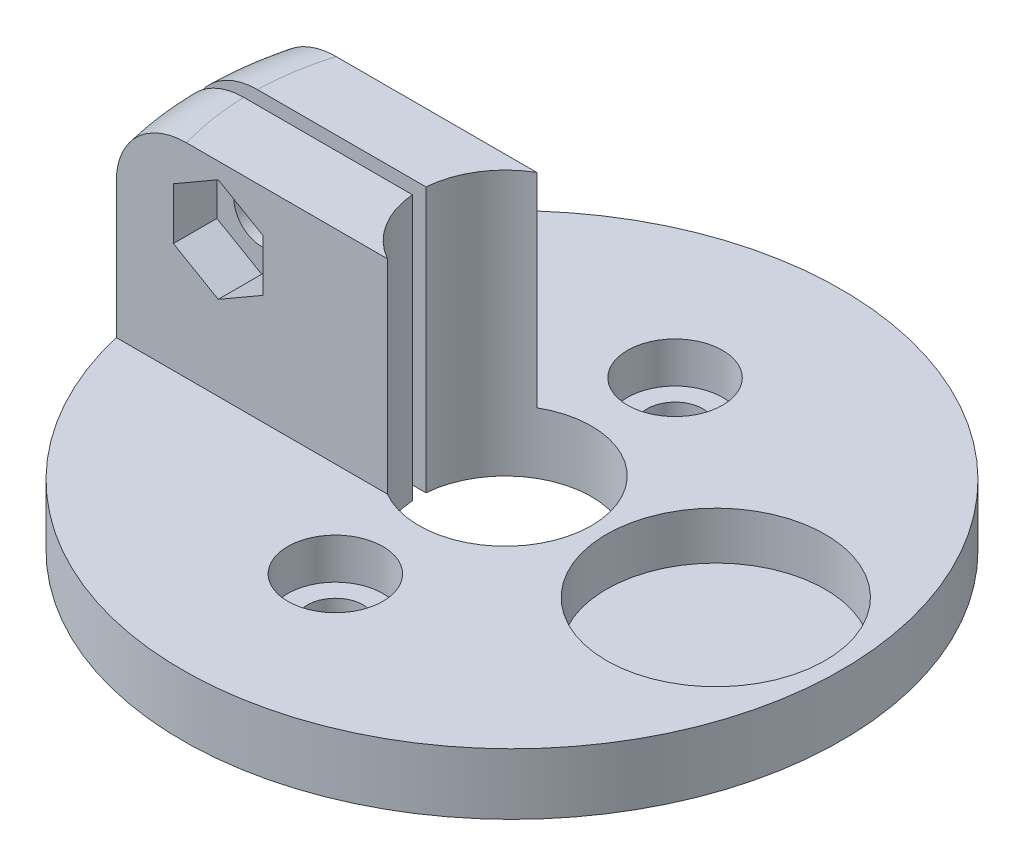
ISO-10303-21;
HEADER;
FILE_DESCRIPTION(('STEP AP214'),'2;1');
FILE_NAME('part.step','',(''),(''),'','','');
FILE_SCHEMA(('AUTOMOTIVE_DESIGN { 1 0 10303 214 1 1 1 1 }'));
ENDSEC;
DATA;
#1=APPLICATION_CONTEXT('core data for automotive mechanical design processes');
#2=APPLICATION_PROTOCOL_DEFINITION('international standard','automotive_design',2000,#1);
#3=PRODUCT_CONTEXT('',#1,'mechanical');
#4=PRODUCT('Part','Part','',(#3));
#5=PRODUCT_RELATED_PRODUCT_CATEGORY('part','',(#4));
#6=PRODUCT_DEFINITION_FORMATION('','',#4);
#7=PRODUCT_DEFINITION_CONTEXT('part definition',#1,'design');
#8=PRODUCT_DEFINITION('design','',#6,#7);
#9=PRODUCT_DEFINITION_SHAPE('','',#8);
#10=(LENGTH_UNIT() NAMED_UNIT(*) SI_UNIT(.MILLI.,.METRE.));
#11=(NAMED_UNIT(*) PLANE_ANGLE_UNIT() SI_UNIT($,.RADIAN.));
#12=(NAMED_UNIT(*) SI_UNIT($,.STERADIAN.) SOLID_ANGLE_UNIT());
#13=UNCERTAINTY_MEASURE_WITH_UNIT(LENGTH_MEASURE(1.E-05),#10,'distance_accuracy_value','');
#14=(GEOMETRIC_REPRESENTATION_CONTEXT(3) GLOBAL_UNCERTAINTY_ASSIGNED_CONTEXT((#13)) GLOBAL_UNIT_ASSIGNED_CONTEXT((#10,
#11,#12)) REPRESENTATION_CONTEXT('',''));
#15=CARTESIAN_POINT('',(0.,0.,0.));
#16=DIRECTION('',(0.,0.,1.));
#17=DIRECTION('',(1.,0.,0.));
#18=AXIS2_PLACEMENT_3D('',#15,#16,#17);
#19=CARTESIAN_POINT('',(-31.236109069228,29.,48.5));
#20=DIRECTION('',(0.,0.,-1.));
#21=DIRECTION('',(-1.,0.,0.));
#22=AXIS2_PLACEMENT_3D('',#19,#20,#21);
#23=CYLINDRICAL_SURFACE('',#22,4.1);
#24=CARTESIAN_POINT('',(-31.236109069228,29.,1.));
#25=DIRECTION('',(0.,0.,1.));
#26=DIRECTION('',(1.,0.,0.));
#27=AXIS2_PLACEMENT_3D('',#24,#25,#26);
#28=CIRCLE('',#27,4.1);
#29=CARTESIAN_POINT('',(-27.136109069228,29.,1.));
#30=VERTEX_POINT('',#29);
#31=EDGE_CURVE('E219',#30,#30,#28,.T.);
#32=ORIENTED_EDGE('',*,*,#31,.F.);
#33=EDGE_LOOP('',(#32));
#34=FACE_BOUND('',#33,.T.);
#35=CARTESIAN_POINT('',(-31.236109069228,29.,4.6));
#36=DIRECTION('',(0.,0.,1.));
#37=DIRECTION('',(1.,0.,0.));
#38=AXIS2_PLACEMENT_3D('',#35,#36,#37);
#39=CIRCLE('',#38,4.1);
#40=CARTESIAN_POINT('',(-27.136109069228,29.,4.6));
#41=VERTEX_POINT('',#40);
#42=EDGE_CURVE('E205',#41,#41,#39,.F.);
#43=ORIENTED_EDGE('',*,*,#42,.F.);
#44=EDGE_LOOP('',(#43));
#45=FACE_BOUND('',#44,.T.);
#46=ADVANCED_FACE('F34',(#34,#45),#23,.F.);
#47=CARTESIAN_POINT('',(0.,9.,0.));
#48=DIRECTION('',(0.,1.,0.));
#49=DIRECTION('',(0.,0.,1.));
#50=AXIS2_PLACEMENT_3D('',#47,#48,#49);
#51=PLANE('',#50);
#52=CARTESIAN_POINT('',(0.,9.,25.));
#53=DIRECTION('',(0.,1.,0.));
#54=DIRECTION('',(0.,0.,1.));
#55=AXIS2_PLACEMENT_3D('',#52,#53,#54);
#56=CIRCLE('',#55,7.);
#57=CARTESIAN_POINT('',(0.,9.,32.));
#58=VERTEX_POINT('',#57);
#59=EDGE_CURVE('E252',#58,#58,#56,.T.);
#60=ORIENTED_EDGE('',*,*,#59,.F.);
#61=EDGE_LOOP('',(#60));
#62=FACE_BOUND('',#61,.T.);
#63=CARTESIAN_POINT('',(0.,9.,-25.));
#64=DIRECTION('',(0.,1.,0.));
#65=DIRECTION('',(0.,0.,1.));
#66=AXIS2_PLACEMENT_3D('',#63,#64,#65);
#67=CIRCLE('',#66,7.);
#68=CARTESIAN_POINT('',(0.,9.,-18.));
#69=VERTEX_POINT('',#68);
#70=EDGE_CURVE('E262',#69,#69,#67,.T.);
#71=ORIENTED_EDGE('',*,*,#70,.F.);
#72=EDGE_LOOP('',(#71));
#73=FACE_BOUND('',#72,.T.);
#74=CARTESIAN_POINT('',(31.,9.,0.));
#75=DIRECTION('',(0.,1.,0.));
#76=DIRECTION('',(0.,0.,1.));
#77=AXIS2_PLACEMENT_3D('',#74,#75,#76);
#78=CIRCLE('',#77,16.1);
#79=CARTESIAN_POINT('',(31.,9.,16.1));
#80=VERTEX_POINT('',#79);
#81=EDGE_CURVE('E276',#80,#80,#78,.T.);
#82=ORIENTED_EDGE('',*,*,#81,.F.);
#83=EDGE_LOOP('',(#82));
#84=FACE_BOUND('',#83,.T.);
#85=CARTESIAN_POINT('',(0.999999999999994,9.,0.));
#86=DIRECTION('',(0.,1.,0.));
#87=DIRECTION('',(0.,0.,1.));
#88=AXIS2_PLACEMENT_3D('',#85,#86,#87);
#89=CIRCLE('',#88,48.5);
#90=CARTESIAN_POINT('',(-46.236109069228,9.,11.));
#91=VERTEX_POINT('',#90);
#92=CARTESIAN_POINT('',(-46.236109069228,9.,-11.));
#93=VERTEX_POINT('',#92);
#94=EDGE_CURVE('E282',#91,#93,#89,.T.);
#95=ORIENTED_EDGE('',*,*,#94,.T.);
#96=DIRECTION('',(-1.,0.,0.));
#97=VECTOR('',#96,1.);
#98=CARTESIAN_POINT('',(0.,9.,-11.));
#99=LINE('',#98,#97);
#100=CARTESIAN_POINT('',(-6.34744042902333,9.,-11.));
#101=VERTEX_POINT('',#100);
#102=EDGE_CURVE('E222',#101,#93,#99,.T.);
#103=ORIENTED_EDGE('',*,*,#102,.F.);
#104=CARTESIAN_POINT('',(0.,9.,0.));
#105=DIRECTION('',(0.,1.,0.));
#106=DIRECTION('',(0.,0.,1.));
#107=AXIS2_PLACEMENT_3D('',#104,#105,#106);
#108=CIRCLE('',#107,12.7);
#109=CARTESIAN_POINT('',(-6.34744042902334,9.,11.));
#110=VERTEX_POINT('',#109);
#111=EDGE_CURVE('E279',#110,#101,#108,.T.);
#112=ORIENTED_EDGE('',*,*,#111,.F.);
#113=DIRECTION('',(1.,0.,0.));
#114=VECTOR('',#113,1.);
#115=CARTESIAN_POINT('',(0.,9.,11.));
#116=LINE('',#115,#114);
#117=EDGE_CURVE('E237',#91,#110,#116,.T.);
#118=ORIENTED_EDGE('',*,*,#117,.F.);
#119=EDGE_LOOP('',(#95,#103,#112,#118));
#120=FACE_BOUND('',#119,.T.);
#121=ADVANCED_FACE('F397',(#62,#73,#84,#120),#51,.T.);
#122=CARTESIAN_POINT('',(0.,9.,0.));
#123=DIRECTION('',(0.,-1.,0.));
#124=DIRECTION('',(0.,0.,-1.));
#125=AXIS2_PLACEMENT_3D('',#122,#123,#124);
#126=CYLINDRICAL_SURFACE('',#125,12.7);
#127=CARTESIAN_POINT('',(0.,0.,0.));
#128=DIRECTION('',(0.,1.,0.));
#129=DIRECTION('',(0.,0.,1.));
#130=AXIS2_PLACEMENT_3D('',#127,#128,#129);
#131=CIRCLE('',#130,12.7);
#132=CARTESIAN_POINT('',(-12.6605687076055,0.,1.));
#133=VERTEX_POINT('',#132);
#134=CARTESIAN_POINT('',(-12.6605687076055,0.,-1.));
#135=VERTEX_POINT('',#134);
#136=EDGE_CURVE('E275',#133,#135,#131,.T.);
#137=ORIENTED_EDGE('',*,*,#136,.F.);
#138=DIRECTION('',(0.,-1.,0.));
#139=VECTOR('',#138,1.);
#140=CARTESIAN_POINT('',(-12.6605687076055,9.,1.));
#141=LINE('',#140,#139);
#142=CARTESIAN_POINT('',(-12.6605687076055,39.,1.));
#143=VERTEX_POINT('',#142);
#144=EDGE_CURVE('E302',#143,#133,#141,.T.);
#145=ORIENTED_EDGE('',*,*,#144,.F.);
#146=CARTESIAN_POINT('',(0.,39.,0.));
#147=DIRECTION('',(0.,1.,0.));
#148=DIRECTION('',(0.,0.,1.));
#149=AXIS2_PLACEMENT_3D('',#146,#147,#148);
#150=CIRCLE('',#149,12.7);
#151=CARTESIAN_POINT('',(-6.34744042902334,39.,11.));
#152=VERTEX_POINT('',#151);
#153=EDGE_CURVE('E240',#152,#143,#150,.F.);
#154=ORIENTED_EDGE('',*,*,#153,.F.);
#155=DIRECTION('',(0.,-1.,0.));
#156=VECTOR('',#155,1.);
#157=CARTESIAN_POINT('',(-6.34744042902334,39.,11.));
#158=LINE('',#157,#156);
#159=EDGE_CURVE('E245',#152,#110,#158,.T.);
#160=ORIENTED_EDGE('',*,*,#159,.T.);
#161=ORIENTED_EDGE('',*,*,#111,.T.);
#162=DIRECTION('',(0.,-1.,0.));
#163=VECTOR('',#162,1.);
#164=CARTESIAN_POINT('',(-6.34744042902333,39.,-11.));
#165=LINE('',#164,#163);
#166=CARTESIAN_POINT('',(-6.34744042902333,39.,-11.));
#167=VERTEX_POINT('',#166);
#168=EDGE_CURVE('E235',#167,#101,#165,.T.);
#169=ORIENTED_EDGE('',*,*,#168,.F.);
#170=CARTESIAN_POINT('',(0.,39.,0.));
#171=DIRECTION('',(0.,1.,0.));
#172=DIRECTION('',(0.,0.,1.));
#173=AXIS2_PLACEMENT_3D('',#170,#171,#172);
#174=CIRCLE('',#173,12.7);
#175=CARTESIAN_POINT('',(-12.6605687076055,39.,-1.));
#176=VERTEX_POINT('',#175);
#177=EDGE_CURVE('E223',#176,#167,#174,.F.);
#178=ORIENTED_EDGE('',*,*,#177,.F.);
#179=DIRECTION('',(0.,-1.,0.));
#180=VECTOR('',#179,1.);
#181=CARTESIAN_POINT('',(-12.6605687076055,9.,-1.));
#182=LINE('',#181,#180);
#183=EDGE_CURVE('E286',#176,#135,#182,.T.);
#184=ORIENTED_EDGE('',*,*,#183,.T.);
#185=EDGE_LOOP('',(#137,#145,#154,#160,#161,#169,#178,#184));
#186=FACE_BOUND('',#185,.T.);
#187=ADVANCED_FACE('F331',(#186),#126,.F.);
#188=CARTESIAN_POINT('',(0.,9.,1.));
#189=DIRECTION('',(0.,0.,1.));
#190=DIRECTION('',(1.,0.,0.));
#191=AXIS2_PLACEMENT_3D('',#188,#189,#190);
#192=PLANE('',#191);
#193=ORIENTED_EDGE('',*,*,#31,.T.);
#194=EDGE_LOOP('',(#193));
#195=FACE_BOUND('',#194,.T.);
#196=DIRECTION('',(0.,-1.,0.));
#197=VECTOR('',#196,1.);
#198=CARTESIAN_POINT('',(-47.4896896257338,9.,1.));
#199=LINE('',#198,#197);
#200=CARTESIAN_POINT('',(-47.4896896257338,29.,1.));
#201=VERTEX_POINT('',#200);
#202=CARTESIAN_POINT('',(-47.4896896257338,0.,1.));
#203=VERTEX_POINT('',#202);
#204=EDGE_CURVE('E300',#201,#203,#199,.T.);
#205=ORIENTED_EDGE('',*,*,#204,.F.);
#206=CARTESIAN_POINT('',(-47.4896896257338,29.,1.));
#207=CARTESIAN_POINT('',(-47.4897198985444,29.2812143088061,1.));
#208=CARTESIAN_POINT('',(-47.4778261512145,29.5624242566157,1.));
#209=CARTESIAN_POINT('',(-47.4304092764863,30.1228318864645,1.));
#210=CARTESIAN_POINT('',(-47.3948872906745,30.4020296650619,1.));
#211=CARTESIAN_POINT('',(-47.3004684806693,30.9562261305562,1.));
#212=CARTESIAN_POINT('',(-47.241589455681,31.2312278497232,1.));
#213=CARTESIAN_POINT('',(-47.1008853270661,31.775293236915,1.));
#214=CARTESIAN_POINT('',(-47.0190605020887,32.0443569770068,1.));
#215=CARTESIAN_POINT('',(-46.8329995152337,32.5747644600281,1.));
#216=CARTESIAN_POINT('',(-46.7287527284584,32.836104475975,1.));
#217=CARTESIAN_POINT('',(-46.498610906432,33.3490786487438,1.));
#218=CARTESIAN_POINT('',(-46.3727154112722,33.6007125992293,1.));
#219=CARTESIAN_POINT('',(-46.1001984055582,34.0924350458101,1.));
#220=CARTESIAN_POINT('',(-45.9535806939322,34.3325256473171,1.));
#221=CARTESIAN_POINT('',(-45.6406456355126,34.7995037376404,1.));
#222=CARTESIAN_POINT('',(-45.4743283933388,35.0263912965655,1.));
#223=CARTESIAN_POINT('',(-45.1231633792935,35.4653694508043,1.));
#224=CARTESIAN_POINT('',(-44.9383142321446,35.6774589459501,1.));
#225=CARTESIAN_POINT('',(-44.551410287888,36.0853161926174,1.));
#226=CARTESIAN_POINT('',(-44.3493554871212,36.2810839406678,1.));
#227=CARTESIAN_POINT('',(-43.9294341594981,36.6549456890802,1.));
#228=CARTESIAN_POINT('',(-43.7115644291291,36.8330360912803,1.));
#229=CARTESIAN_POINT('',(-43.2616027056128,37.1702307446027,1.));
#230=CARTESIAN_POINT('',(-43.0295109286725,37.3293352842441,1.));
#231=CARTESIAN_POINT('',(-42.5526520508533,37.6274941996331,1.));
#232=CARTESIAN_POINT('',(-42.3078797170166,37.7665402066745,1.));
#233=CARTESIAN_POINT('',(-41.8074976569067,38.0235134797579,1.));
#234=CARTESIAN_POINT('',(-41.5518881078086,38.1414410908948,1.));
#235=CARTESIAN_POINT('',(-41.0317509500219,38.3552958103968,1.));
#236=CARTESIAN_POINT('',(-40.767227451941,38.4512329045115,1.));
#237=CARTESIAN_POINT('',(-40.231146038111,38.6204710836165,1.));
#238=CARTESIAN_POINT('',(-39.9595898245698,38.6937775916568,1.));
#239=CARTESIAN_POINT('',(-39.3247427411582,38.8367331249634,1.));
#240=CARTESIAN_POINT('',(-38.9594995829005,38.8979568562553,1.));
#241=CARTESIAN_POINT('',(-38.4086976736737,38.9591759352337,1.));
#242=CARTESIAN_POINT('',(-38.2247010843263,38.9744795287047,1.));
#243=CARTESIAN_POINT('',(-37.8561550458119,38.9948903186886,1.));
#244=CARTESIAN_POINT('',(-37.6716056330455,38.9999981723774,1.));
#245=CARTESIAN_POINT('',(-37.4870107958516,39.,1.));
#246=B_SPLINE_CURVE_WITH_KNOTS('',3,(#206,#207,#208,#209,#210,#211,#212,#213,#214,#215,#216,
#217,#218,#219,#220,#221,#222,#223,#224,#225,#226,#227,#228,#229,#230,#231,#232,#233,#234,#235,
#236,#237,#238,#239,#240,#241,#242,#243,#244,#245),.UNSPECIFIED.,.F.,.F.,(4,2,2,2,2,2,2,2,2,2,2,
2,2,2,2,2,2,2,2,4),(0.,0.843385365964099,1.68672998713896,2.52943316927484,3.37212611823544,
4.21521926991456,5.05833033462284,5.90128703487383,6.74423925857047,7.58725408525018,
8.43026909120854,9.27345533954945,10.1166287727544,10.9601529788083,11.8036633996026,
12.646790025664,13.4897144530993,14.5981490589019,15.1518079413977,15.7054311361422),.UNSPECIFIED.);
#247=CARTESIAN_POINT('',(-37.4870107958516,39.,1.));
#248=VERTEX_POINT('',#247);
#249=EDGE_CURVE('E11',#201,#248,#246,.T.);
#250=ORIENTED_EDGE('',*,*,#249,.T.);
#251=DIRECTION('',(-1.,0.,0.));
#252=VECTOR('',#251,1.);
#253=CARTESIAN_POINT('',(0.,39.,1.));
#254=LINE('',#253,#252);
#255=EDGE_CURVE('E243',#143,#248,#254,.T.);
#256=ORIENTED_EDGE('',*,*,#255,.F.);
#257=ORIENTED_EDGE('',*,*,#144,.T.);
#258=DIRECTION('',(-1.,0.,0.));
#259=VECTOR('',#258,1.);
#260=CARTESIAN_POINT('',(0.,0.,1.));
#261=LINE('',#260,#259);
#262=EDGE_CURVE('E289',#133,#203,#261,.T.);
#263=ORIENTED_EDGE('',*,*,#262,.T.);
#264=EDGE_LOOP('',(#205,#250,#256,#257,#263));
#265=FACE_BOUND('',#264,.T.);
#266=ADVANCED_FACE('F374',(#195,#265),#192,.F.);
#267=CARTESIAN_POINT('',(0.999999999999994,9.,0.));
#268=DIRECTION('',(0.,-1.,0.));
#269=DIRECTION('',(0.,0.,-1.));
#270=AXIS2_PLACEMENT_3D('',#267,#268,#269);
#271=CYLINDRICAL_SURFACE('',#270,48.5);
#272=DIRECTION('',(0.,-1.,0.));
#273=VECTOR('',#272,1.);
#274=CARTESIAN_POINT('',(-47.4896896257338,9.,-1.));
#275=LINE('',#274,#273);
#276=CARTESIAN_POINT('',(-47.4896896257338,29.,-1.));
#277=VERTEX_POINT('',#276);
#278=CARTESIAN_POINT('',(-47.4896896257338,0.,-1.));
#279=VERTEX_POINT('',#278);
#280=EDGE_CURVE('E298',#277,#279,#275,.T.);
#281=ORIENTED_EDGE('',*,*,#280,.F.);
#282=CARTESIAN_POINT('',(0.999999999999994,29.,0.));
#283=DIRECTION('',(0.,1.,0.));
#284=DIRECTION('',(0.,0.,1.));
#285=AXIS2_PLACEMENT_3D('',#282,#283,#284);
#286=CIRCLE('',#285,48.5);
#287=CARTESIAN_POINT('',(-46.236109069228,29.,-11.));
#288=VERTEX_POINT('',#287);
#289=EDGE_CURVE('E342',#277,#288,#286,.F.);
#290=ORIENTED_EDGE('',*,*,#289,.T.);
#291=DIRECTION('',(0.,-1.,0.));
#292=VECTOR('',#291,1.);
#293=CARTESIAN_POINT('',(-46.236109069228,39.,-11.));
#294=LINE('',#293,#292);
#295=EDGE_CURVE('E231',#288,#93,#294,.T.);
#296=ORIENTED_EDGE('',*,*,#295,.T.);
#297=ORIENTED_EDGE('',*,*,#94,.F.);
#298=DIRECTION('',(0.,-1.,0.));
#299=VECTOR('',#298,1.);
#300=CARTESIAN_POINT('',(-46.236109069228,39.,11.));
#301=LINE('',#300,#299);
#302=CARTESIAN_POINT('',(-46.236109069228,29.,11.));
#303=VERTEX_POINT('',#302);
#304=EDGE_CURVE('E250',#303,#91,#301,.T.);
#305=ORIENTED_EDGE('',*,*,#304,.F.);
#306=CARTESIAN_POINT('',(0.999999999999994,29.,0.));
#307=DIRECTION('',(0.,1.,0.));
#308=DIRECTION('',(0.,0.,1.));
#309=AXIS2_PLACEMENT_3D('',#306,#307,#308);
#310=CIRCLE('',#309,48.5);
#311=EDGE_CURVE('E320',#303,#201,#310,.F.);
#312=ORIENTED_EDGE('',*,*,#311,.T.);
#313=ORIENTED_EDGE('',*,*,#204,.T.);
#314=CARTESIAN_POINT('',(0.999999999999994,0.,0.));
#315=DIRECTION('',(0.,1.,0.));
#316=DIRECTION('',(0.,0.,1.));
#317=AXIS2_PLACEMENT_3D('',#314,#315,#316);
#318=CIRCLE('',#317,48.5);
#319=EDGE_CURVE('E292',#203,#279,#318,.T.);
#320=ORIENTED_EDGE('',*,*,#319,.T.);
#321=EDGE_LOOP('',(#281,#290,#296,#297,#305,#312,#313,#320));
#322=FACE_BOUND('',#321,.T.);
#323=ADVANCED_FACE('F388',(#322),#271,.T.);
#324=CARTESIAN_POINT('',(0.,9.,-1.));
#325=DIRECTION('',(0.,0.,1.));
#326=DIRECTION('',(1.,0.,0.));
#327=AXIS2_PLACEMENT_3D('',#324,#325,#326);
#328=PLANE('',#327);
#329=CARTESIAN_POINT('',(-31.236109069228,29.,-1.));
#330=DIRECTION('',(0.,0.,1.));
#331=DIRECTION('',(1.,0.,0.));
#332=AXIS2_PLACEMENT_3D('',#329,#330,#331);
#333=CIRCLE('',#332,4.1);
#334=CARTESIAN_POINT('',(-27.136109069228,29.,-1.));
#335=VERTEX_POINT('',#334);
#336=EDGE_CURVE('E216',#335,#335,#333,.T.);
#337=ORIENTED_EDGE('',*,*,#336,.F.);
#338=EDGE_LOOP('',(#337));
#339=FACE_BOUND('',#338,.T.);
#340=DIRECTION('',(1.,0.,0.));
#341=VECTOR('',#340,1.);
#342=CARTESIAN_POINT('',(0.,39.,-1.));
#343=LINE('',#342,#341);
#344=CARTESIAN_POINT('',(-37.4870107958516,39.,-1.));
#345=VERTEX_POINT('',#344);
#346=EDGE_CURVE('E229',#345,#176,#343,.T.);
#347=ORIENTED_EDGE('',*,*,#346,.F.);
#348=CARTESIAN_POINT('',(-37.4870107958516,39.,-1.));
#349=CARTESIAN_POINT('',(-37.7684082248213,39.0000302153413,-1.));
#350=CARTESIAN_POINT('',(-38.0498014296061,38.9881316028643,-1.));
#351=CARTESIAN_POINT('',(-38.6105754757362,38.9406938325028,-1.));
#352=CARTESIAN_POINT('',(-38.8899564104702,38.9051557789534,-1.));
#353=CARTESIAN_POINT('',(-39.4445221231869,38.810691380952,-1.));
#354=CARTESIAN_POINT('',(-39.7197098707045,38.7517824709605,-1.));
#355=CARTESIAN_POINT('',(-40.2641442001352,38.611003411102,-1.));
#356=CARTESIAN_POINT('',(-40.5333908563894,38.5291335487223,-1.));
#357=CARTESIAN_POINT('',(-41.0641614633031,38.3429647650613,-1.));
#358=CARTESIAN_POINT('',(-41.3256816182714,38.2386550217706,-1.));
#359=CARTESIAN_POINT('',(-41.8390081615933,38.0083684236071,-1.));
#360=CARTESIAN_POINT('',(-42.0908143462365,37.8823911146483,-1.));
#361=CARTESIAN_POINT('',(-42.5828690698445,37.6096909430355,-1.));
#362=CARTESIAN_POINT('',(-42.8231197678404,37.4629719760982,-1.));
#363=CARTESIAN_POINT('',(-43.2904033503818,37.149813596817,-1.));
#364=CARTESIAN_POINT('',(-43.5174363085148,36.9833742942787,-1.));
#365=CARTESIAN_POINT('',(-43.9566265245862,36.6319920136189,-1.));
#366=CARTESIAN_POINT('',(-44.1687867256399,36.4470527140737,-1.));
#367=CARTESIAN_POINT('',(-44.5767713468528,36.0599568582761,-1.));
#368=CARTESIAN_POINT('',(-44.7725957706482,35.857800305856,-1.));
#369=CARTESIAN_POINT('',(-45.1465534633562,35.4376635986338,-1.));
#370=CARTESIAN_POINT('',(-45.3246831161969,35.2196802251804,-1.));
#371=CARTESIAN_POINT('',(-45.6619348061699,34.7694802537021,-1.));
#372=CARTESIAN_POINT('',(-45.8210571395327,34.5372638775852,-1.));
#373=CARTESIAN_POINT('',(-46.1191579861763,34.0602556936932,-1.));
#374=CARTESIAN_POINT('',(-46.2581373522482,33.8154644188951,-1.));
#375=CARTESIAN_POINT('',(-46.5149680400892,33.3150465252219,-1.));
#376=CARTESIAN_POINT('',(-46.6328197185563,33.0594200893664,-1.));
#377=CARTESIAN_POINT('',(-46.8465101665711,32.5392536335722,-1.));
#378=CARTESIAN_POINT('',(-46.9423590809273,32.2747177862712,-1.));
#379=CARTESIAN_POINT('',(-47.11140721342,31.7386157298111,-1.));
#380=CARTESIAN_POINT('',(-47.1846118898619,31.4670512320107,-1.));
#381=CARTESIAN_POINT('',(-47.3271129472702,30.8330855368567,-1.));
#382=CARTESIAN_POINT('',(-47.3880772126281,30.4687573747386,-1.));
#383=CARTESIAN_POINT('',(-47.449037497879,29.9193458592582,-1.));
#384=CARTESIAN_POINT('',(-47.4642765606644,29.7358155830948,-1.));
#385=CARTESIAN_POINT('',(-47.4846014081745,29.3682052182856,-1.));
#386=CARTESIAN_POINT('',(-47.4896878331329,29.1841251650425,-1.));
#387=CARTESIAN_POINT('',(-47.4896896257338,29.,-1.));
#388=B_SPLINE_CURVE_WITH_KNOTS('',3,(#348,#349,#350,#351,#352,#353,#354,#355,#356,#357,#358,
#359,#360,#361,#362,#363,#364,#365,#366,#367,#368,#369,#370,#371,#372,#373,#374,#375,#376,#377,
#378,#379,#380,#381,#382,#383,#384,#385,#386,#387),.UNSPECIFIED.,.F.,.F.,(4,2,2,2,2,2,2,2,2,2,2,
2,2,2,2,2,2,2,2,4),(0.,0.843934890226332,1.68783035813856,2.53109746739189,3.37435401881268,
4.21801816019959,5.0616999843585,5.90522355745103,6.74874243391179,7.59209391554777,
8.43544520945869,9.27896849610063,10.1224786346472,10.9659530511392,11.8094132259463,
12.6524837221778,13.4953508409054,14.6009661993717,15.1532162520542,15.7054314782883),.UNSPECIFIED.);
#389=EDGE_CURVE('E313',#345,#277,#388,.T.);
#390=ORIENTED_EDGE('',*,*,#389,.T.);
#391=ORIENTED_EDGE('',*,*,#280,.T.);
#392=DIRECTION('',(-1.,0.,0.));
#393=VECTOR('',#392,1.);
#394=CARTESIAN_POINT('',(0.,0.,-1.));
#395=LINE('',#394,#393);
#396=EDGE_CURVE('E283',#135,#279,#395,.T.);
#397=ORIENTED_EDGE('',*,*,#396,.F.);
#398=ORIENTED_EDGE('',*,*,#183,.F.);
#399=EDGE_LOOP('',(#347,#390,#391,#397,#398));
#400=FACE_BOUND('',#399,.T.);
#401=ADVANCED_FACE('F322',(#339,#400),#328,.T.);
#402=CARTESIAN_POINT('',(0.,0.,0.));
#403=DIRECTION('',(0.,1.,0.));
#404=DIRECTION('',(0.,0.,1.));
#405=AXIS2_PLACEMENT_3D('',#402,#403,#404);
#406=PLANE('',#405);
#407=CARTESIAN_POINT('',(0.,0.,25.));
#408=DIRECTION('',(0.,1.,0.));
#409=DIRECTION('',(0.,0.,1.));
#410=AXIS2_PLACEMENT_3D('',#407,#408,#409);
#411=CIRCLE('',#410,4.1);
#412=CARTESIAN_POINT('',(0.,0.,29.1));
#413=VERTEX_POINT('',#412);
#414=EDGE_CURVE('E261',#413,#413,#411,.T.);
#415=ORIENTED_EDGE('',*,*,#414,.T.);
#416=EDGE_LOOP('',(#415));
#417=FACE_BOUND('',#416,.T.);
#418=CARTESIAN_POINT('',(0.,0.,-25.));
#419=DIRECTION('',(0.,1.,0.));
#420=DIRECTION('',(0.,0.,1.));
#421=AXIS2_PLACEMENT_3D('',#418,#419,#420);
#422=CIRCLE('',#421,4.1);
#423=CARTESIAN_POINT('',(0.,0.,-20.9));
#424=VERTEX_POINT('',#423);
#425=EDGE_CURVE('E271',#424,#424,#422,.T.);
#426=ORIENTED_EDGE('',*,*,#425,.T.);
#427=EDGE_LOOP('',(#426));
#428=FACE_BOUND('',#427,.T.);
#429=ORIENTED_EDGE('',*,*,#136,.T.);
#430=ORIENTED_EDGE('',*,*,#396,.T.);
#431=ORIENTED_EDGE('',*,*,#319,.F.);
#432=ORIENTED_EDGE('',*,*,#262,.F.);
#433=EDGE_LOOP('',(#429,#430,#431,#432));
#434=FACE_BOUND('',#433,.T.);
#435=ADVANCED_FACE('F378',(#417,#428,#434),#406,.F.);
#436=CARTESIAN_POINT('',(31.,2.,0.));
#437=DIRECTION('',(0.,1.,0.));
#438=DIRECTION('',(0.,0.,1.));
#439=AXIS2_PLACEMENT_3D('',#436,#437,#438);
#440=CYLINDRICAL_SURFACE('',#439,16.1);
#441=CARTESIAN_POINT('',(31.,2.,0.));
#442=DIRECTION('',(0.,1.,0.));
#443=DIRECTION('',(0.,0.,1.));
#444=AXIS2_PLACEMENT_3D('',#441,#442,#443);
#445=CIRCLE('',#444,16.1);
#446=CARTESIAN_POINT('',(31.,2.,16.1));
#447=VERTEX_POINT('',#446);
#448=EDGE_CURVE('E272',#447,#447,#445,.T.);
#449=ORIENTED_EDGE('',*,*,#448,.F.);
#450=EDGE_LOOP('',(#449));
#451=FACE_BOUND('',#450,.T.);
#452=ORIENTED_EDGE('',*,*,#81,.T.);
#453=EDGE_LOOP('',(#452));
#454=FACE_BOUND('',#453,.T.);
#455=ADVANCED_FACE('F410',(#451,#454),#440,.F.);
#456=CARTESIAN_POINT('',(31.,2.,0.));
#457=DIRECTION('',(0.,1.,0.));
#458=DIRECTION('',(0.,0.,1.));
#459=AXIS2_PLACEMENT_3D('',#456,#457,#458);
#460=PLANE('',#459);
#461=ORIENTED_EDGE('',*,*,#448,.T.);
#462=EDGE_LOOP('',(#461));
#463=FACE_BOUND('',#462,.T.);
#464=ADVANCED_FACE('F418',(#463),#460,.T.);
#465=CARTESIAN_POINT('',(0.,9.,-25.));
#466=DIRECTION('',(0.,1.,0.));
#467=DIRECTION('',(0.,0.,1.));
#468=AXIS2_PLACEMENT_3D('',#465,#466,#467);
#469=CYLINDRICAL_SURFACE('',#468,4.1);
#470=CARTESIAN_POINT('',(0.,3.,-25.));
#471=DIRECTION('',(0.,1.,0.));
#472=DIRECTION('',(0.,0.,1.));
#473=AXIS2_PLACEMENT_3D('',#470,#471,#472);
#474=CIRCLE('',#473,4.1);
#475=CARTESIAN_POINT('',(0.,3.,-20.9));
#476=VERTEX_POINT('',#475);
#477=EDGE_CURVE('E268',#476,#476,#474,.T.);
#478=ORIENTED_EDGE('',*,*,#477,.T.);
#479=EDGE_LOOP('',(#478));
#480=FACE_BOUND('',#479,.T.);
#481=ORIENTED_EDGE('',*,*,#425,.F.);
#482=EDGE_LOOP('',(#481));
#483=FACE_BOUND('',#482,.T.);
#484=ADVANCED_FACE('F425',(#480,#483),#469,.F.);
#485=CARTESIAN_POINT('',(4.09999999999999,3.,-25.));
#486=DIRECTION('',(0.,-1.,0.));
#487=DIRECTION('',(0.,0.,-1.));
#488=AXIS2_PLACEMENT_3D('',#485,#486,#487);
#489=PLANE('',#488);
#490=ORIENTED_EDGE('',*,*,#477,.F.);
#491=EDGE_LOOP('',(#490));
#492=FACE_BOUND('',#491,.T.);
#493=CARTESIAN_POINT('',(0.,3.,-25.));
#494=DIRECTION('',(0.,1.,0.));
#495=DIRECTION('',(0.,0.,1.));
#496=AXIS2_PLACEMENT_3D('',#493,#494,#495);
#497=CIRCLE('',#496,7.);
#498=CARTESIAN_POINT('',(0.,3.,-18.));
#499=VERTEX_POINT('',#498);
#500=EDGE_CURVE('E265',#499,#499,#497,.T.);
#501=ORIENTED_EDGE('',*,*,#500,.T.);
#502=EDGE_LOOP('',(#501));
#503=FACE_BOUND('',#502,.T.);
#504=ADVANCED_FACE('F427',(#492,#503),#489,.F.);
#505=CARTESIAN_POINT('',(0.,9.,-25.));
#506=DIRECTION('',(0.,1.,0.));
#507=DIRECTION('',(0.,0.,1.));
#508=AXIS2_PLACEMENT_3D('',#505,#506,#507);
#509=CYLINDRICAL_SURFACE('',#508,7.);
#510=ORIENTED_EDGE('',*,*,#500,.F.);
#511=EDGE_LOOP('',(#510));
#512=FACE_BOUND('',#511,.T.);
#513=ORIENTED_EDGE('',*,*,#70,.T.);
#514=EDGE_LOOP('',(#513));
#515=FACE_BOUND('',#514,.T.);
#516=ADVANCED_FACE('F434',(#512,#515),#509,.F.);
#517=CARTESIAN_POINT('',(0.,9.,25.));
#518=DIRECTION('',(0.,1.,0.));
#519=DIRECTION('',(0.,0.,1.));
#520=AXIS2_PLACEMENT_3D('',#517,#518,#519);
#521=CYLINDRICAL_SURFACE('',#520,4.1);
#522=CARTESIAN_POINT('',(0.,3.,25.));
#523=DIRECTION('',(0.,1.,0.));
#524=DIRECTION('',(0.,0.,1.));
#525=AXIS2_PLACEMENT_3D('',#522,#523,#524);
#526=CIRCLE('',#525,4.1);
#527=CARTESIAN_POINT('',(0.,3.,29.1));
#528=VERTEX_POINT('',#527);
#529=EDGE_CURVE('E258',#528,#528,#526,.T.);
#530=ORIENTED_EDGE('',*,*,#529,.T.);
#531=EDGE_LOOP('',(#530));
#532=FACE_BOUND('',#531,.T.);
#533=ORIENTED_EDGE('',*,*,#414,.F.);
#534=EDGE_LOOP('',(#533));
#535=FACE_BOUND('',#534,.T.);
#536=ADVANCED_FACE('F441',(#532,#535),#521,.F.);
#537=CARTESIAN_POINT('',(4.10000000000001,3.,25.));
#538=DIRECTION('',(0.,-1.,0.));
#539=DIRECTION('',(0.,0.,-1.));
#540=AXIS2_PLACEMENT_3D('',#537,#538,#539);
#541=PLANE('',#540);
#542=ORIENTED_EDGE('',*,*,#529,.F.);
#543=EDGE_LOOP('',(#542));
#544=FACE_BOUND('',#543,.T.);
#545=CARTESIAN_POINT('',(0.,3.,25.));
#546=DIRECTION('',(0.,1.,0.));
#547=DIRECTION('',(0.,0.,1.));
#548=AXIS2_PLACEMENT_3D('',#545,#546,#547);
#549=CIRCLE('',#548,7.);
#550=CARTESIAN_POINT('',(0.,3.,32.));
#551=VERTEX_POINT('',#550);
#552=EDGE_CURVE('E255',#551,#551,#549,.T.);
#553=ORIENTED_EDGE('',*,*,#552,.T.);
#554=EDGE_LOOP('',(#553));
#555=FACE_BOUND('',#554,.T.);
#556=ADVANCED_FACE('F444',(#544,#555),#541,.F.);
#557=CARTESIAN_POINT('',(0.,9.,25.));
#558=DIRECTION('',(0.,1.,0.));
#559=DIRECTION('',(0.,0.,1.));
#560=AXIS2_PLACEMENT_3D('',#557,#558,#559);
#561=CYLINDRICAL_SURFACE('',#560,7.);
#562=ORIENTED_EDGE('',*,*,#552,.F.);
#563=EDGE_LOOP('',(#562));
#564=FACE_BOUND('',#563,.T.);
#565=ORIENTED_EDGE('',*,*,#59,.T.);
#566=EDGE_LOOP('',(#565));
#567=FACE_BOUND('',#566,.T.);
#568=ADVANCED_FACE('F359',(#564,#567),#561,.F.);
#569=CARTESIAN_POINT('',(0.,39.,11.));
#570=DIRECTION('',(0.,0.,-1.));
#571=DIRECTION('',(-1.,0.,0.));
#572=AXIS2_PLACEMENT_3D('',#569,#570,#571);
#573=PLANE('',#572);
#574=DIRECTION('',(0.,1.,0.));
#575=VECTOR('',#574,1.);
#576=CARTESIAN_POINT('',(-24.636109069228,25.1894882233485,11.));
#577=LINE('',#576,#575);
#578=CARTESIAN_POINT('',(-24.636109069228,25.1894882233485,11.));
#579=VERTEX_POINT('',#578);
#580=CARTESIAN_POINT('',(-24.636109069228,32.8105117766515,11.));
#581=VERTEX_POINT('',#580);
#582=EDGE_CURVE('E193',#579,#581,#577,.T.);
#583=ORIENTED_EDGE('',*,*,#582,.F.);
#584=DIRECTION('',(0.866025403784439,0.5,0.));
#585=VECTOR('',#584,1.);
#586=CARTESIAN_POINT('',(-31.236109069228,21.3789764466969,11.));
#587=LINE('',#586,#585);
#588=CARTESIAN_POINT('',(-31.236109069228,21.3789764466969,11.));
#589=VERTEX_POINT('',#588);
#590=EDGE_CURVE('E160',#589,#579,#587,.T.);
#591=ORIENTED_EDGE('',*,*,#590,.F.);
#592=DIRECTION('',(0.866025403784439,-0.5,0.));
#593=VECTOR('',#592,1.);
#594=CARTESIAN_POINT('',(-37.836109069228,25.1894882233485,11.));
#595=LINE('',#594,#593);
#596=CARTESIAN_POINT('',(-37.836109069228,25.1894882233485,11.));
#597=VERTEX_POINT('',#596);
#598=EDGE_CURVE('E179',#597,#589,#595,.T.);
#599=ORIENTED_EDGE('',*,*,#598,.F.);
#600=DIRECTION('',(0.,-1.,0.));
#601=VECTOR('',#600,1.);
#602=CARTESIAN_POINT('',(-37.836109069228,32.8105117766515,11.));
#603=LINE('',#602,#601);
#604=CARTESIAN_POINT('',(-37.836109069228,32.8105117766515,11.));
#605=VERTEX_POINT('',#604);
#606=EDGE_CURVE('E182',#605,#597,#603,.T.);
#607=ORIENTED_EDGE('',*,*,#606,.F.);
#608=DIRECTION('',(-0.866025403784439,-0.5,0.));
#609=VECTOR('',#608,1.);
#610=CARTESIAN_POINT('',(-31.236109069228,36.6210235533031,11.));
#611=LINE('',#610,#609);
#612=CARTESIAN_POINT('',(-31.236109069228,36.6210235533031,11.));
#613=VERTEX_POINT('',#612);
#614=EDGE_CURVE('E198',#613,#605,#611,.T.);
#615=ORIENTED_EDGE('',*,*,#614,.F.);
#616=DIRECTION('',(-0.866025403784439,0.5,0.));
#617=VECTOR('',#616,1.);
#618=CARTESIAN_POINT('',(-24.636109069228,32.8105117766515,11.));
#619=LINE('',#618,#617);
#620=EDGE_CURVE('E195',#581,#613,#619,.T.);
#621=ORIENTED_EDGE('',*,*,#620,.F.);
#622=EDGE_LOOP('',(#583,#591,#599,#607,#615,#621));
#623=FACE_BOUND('',#622,.T.);
#624=DIRECTION('',(1.,0.,0.));
#625=VECTOR('',#624,1.);
#626=CARTESIAN_POINT('',(0.,39.,11.));
#627=LINE('',#626,#625);
#628=CARTESIAN_POINT('',(-35.8951216287465,39.,11.));
#629=VERTEX_POINT('',#628);
#630=EDGE_CURVE('E238',#629,#152,#627,.T.);
#631=ORIENTED_EDGE('',*,*,#630,.F.);
#632=CARTESIAN_POINT('',(-35.8951216287465,39.,11.));
#633=CARTESIAN_POINT('',(-36.1944235985123,39.0000266477396,11.));
#634=CARTESIAN_POINT('',(-36.4937373559162,38.9876605565712,11.));
#635=CARTESIAN_POINT('',(-37.090344268753,38.9381791209002,11.));
#636=CARTESIAN_POINT('',(-37.3876371924441,38.9010609847253,11.));
#637=CARTESIAN_POINT('',(-37.9782914114419,38.8020779079423,11.));
#638=CARTESIAN_POINT('',(-38.2716498831416,38.7401960847398,11.));
#639=CARTESIAN_POINT('',(-38.8520974749696,38.5919311687804,11.));
#640=CARTESIAN_POINT('',(-39.139186923598,38.5055493631697,11.));
#641=CARTESIAN_POINT('',(-39.7053670482735,38.3085571287727,11.));
#642=CARTESIAN_POINT('',(-39.9844465264231,38.197914487158,11.));
#643=CARTESIAN_POINT('',(-40.5320754878564,37.9530650304907,11.));
#644=CARTESIAN_POINT('',(-40.800625022226,37.8188583297761,11.));
#645=CARTESIAN_POINT('',(-41.3249225362982,37.5277647766613,11.));
#646=CARTESIAN_POINT('',(-41.5806784769314,37.3708922706772,11.));
#647=CARTESIAN_POINT('',(-42.0775040151608,37.0353996816535,11.));
#648=CARTESIAN_POINT('',(-42.3185740904091,36.8567803064897,11.));
#649=CARTESIAN_POINT('',(-42.7779652840847,36.4839213897167,11.));
#650=CARTESIAN_POINT('',(-42.9967157229382,36.2902107016657,11.));
#651=CARTESIAN_POINT('',(-43.416638261773,35.8845937159244,11.));
#652=CARTESIAN_POINT('',(-43.6178109502386,35.6726880278547,11.));
#653=CARTESIAN_POINT('',(-44.00097264979,35.2320989199414,11.));
#654=CARTESIAN_POINT('',(-44.1829572289488,35.0034116446077,11.));
#655=CARTESIAN_POINT('',(-44.5261550656597,34.530954706954,11.));
#656=CARTESIAN_POINT('',(-44.687369216091,34.287185693635,11.));
#657=CARTESIAN_POINT('',(-44.9828997042264,33.7942966204644,11.));
#658=CARTESIAN_POINT('',(-45.1179056275404,33.5455898135374,11.));
#659=CARTESIAN_POINT('',(-45.3660488907272,33.0375057478934,11.));
#660=CARTESIAN_POINT('',(-45.4791872562472,32.7781289903181,11.));
#661=CARTESIAN_POINT('',(-45.6825834634785,32.2507893045381,11.));
#662=CARTESIAN_POINT('',(-45.772859892546,31.982833552253,11.));
#663=CARTESIAN_POINT('',(-45.9298728323431,31.440226059007,11.));
#664=CARTESIAN_POINT('',(-45.9966169085722,31.1655765004765,11.));
#665=CARTESIAN_POINT('',(-46.112749742343,30.5775159700378,11.));
#666=CARTESIAN_POINT('',(-46.1590130843502,30.2634763329827,11.));
#667=CARTESIAN_POINT('',(-46.2052679006737,29.7905167810245,11.));
#668=CARTESIAN_POINT('',(-46.2168294612669,29.6326441473674,11.));
#669=CARTESIAN_POINT('',(-46.232249864845,29.3165236053908,11.));
#670=CARTESIAN_POINT('',(-46.2361087309112,29.1582756981973,11.));
#671=CARTESIAN_POINT('',(-46.236109069228,29.,11.));
#672=B_SPLINE_CURVE_WITH_KNOTS('',3,(#632,#633,#634,#635,#636,#637,#638,#639,#640,#641,#642,
#643,#644,#645,#646,#647,#648,#649,#650,#651,#652,#653,#654,#655,#656,#657,#658,#659,#660,#661,
#662,#663,#664,#665,#666,#667,#668,#669,#670,#671),.UNSPECIFIED.,.F.,.F.,(4,2,2,2,2,2,2,2,2,2,2,
2,2,2,2,2,2,2,2,4),(0.,0.897668467432537,1.79543819599697,2.6938210228454,3.59215666044343,
4.49169238350519,5.39122374193834,6.29018821239413,7.18912342875104,8.06461482129803,
8.94007689208186,9.81574072966383,10.6913669116432,11.5392920243356,12.3871773574098,
13.234371108099,14.081292242576,15.0319062017033,15.5066322621373,15.9813569000405),.UNSPECIFIED.);
#673=EDGE_CURVE('E48',#629,#303,#672,.T.);
#674=ORIENTED_EDGE('',*,*,#673,.T.);
#675=ORIENTED_EDGE('',*,*,#304,.T.);
#676=ORIENTED_EDGE('',*,*,#117,.T.);
#677=ORIENTED_EDGE('',*,*,#159,.F.);
#678=EDGE_LOOP('',(#631,#674,#675,#676,#677));
#679=FACE_BOUND('',#678,.T.);
#680=ADVANCED_FACE('F354',(#623,#679),#573,.F.);
#681=CARTESIAN_POINT('',(0.,39.,0.));
#682=DIRECTION('',(0.,1.,0.));
#683=DIRECTION('',(0.,0.,1.));
#684=AXIS2_PLACEMENT_3D('',#681,#682,#683);
#685=PLANE('',#684);
#686=ORIENTED_EDGE('',*,*,#255,.T.);
#687=CARTESIAN_POINT('',(0.999999999999994,39.,0.));
#688=DIRECTION('',(0.,1.,0.));
#689=DIRECTION('',(0.,0.,1.));
#690=AXIS2_PLACEMENT_3D('',#687,#688,#689);
#691=CIRCLE('',#690,38.5);
#692=EDGE_CURVE('E341',#248,#629,#691,.T.);
#693=ORIENTED_EDGE('',*,*,#692,.T.);
#694=ORIENTED_EDGE('',*,*,#630,.T.);
#695=ORIENTED_EDGE('',*,*,#153,.T.);
#696=EDGE_LOOP('',(#686,#693,#694,#695));
#697=FACE_BOUND('',#696,.T.);
#698=ADVANCED_FACE('F349',(#697),#685,.T.);
#699=CARTESIAN_POINT('',(0.,39.,-11.));
#700=DIRECTION('',(0.,0.,1.));
#701=DIRECTION('',(1.,0.,0.));
#702=AXIS2_PLACEMENT_3D('',#699,#700,#701);
#703=PLANE('',#702);
#704=CARTESIAN_POINT('',(-31.236109069228,29.,-11.));
#705=DIRECTION('',(0.,0.,-1.));
#706=DIRECTION('',(-1.,0.,0.));
#707=AXIS2_PLACEMENT_3D('',#704,#705,#706);
#708=CIRCLE('',#707,4.1);
#709=CARTESIAN_POINT('',(-35.336109069228,29.,-11.));
#710=VERTEX_POINT('',#709);
#711=EDGE_CURVE('E213',#710,#710,#708,.T.);
#712=ORIENTED_EDGE('',*,*,#711,.F.);
#713=EDGE_LOOP('',(#712));
#714=FACE_BOUND('',#713,.T.);
#715=ORIENTED_EDGE('',*,*,#295,.F.);
#716=CARTESIAN_POINT('',(-46.236109069228,29.,-11.));
#717=CARTESIAN_POINT('',(-46.2361428244034,29.2756052966274,-11.));
#718=CARTESIAN_POINT('',(-46.2244119291636,29.5512041400598,-11.));
#719=CARTESIAN_POINT('',(-46.1776658389033,30.1003959903665,-11.));
#720=CARTESIAN_POINT('',(-46.1426527464747,30.3739891761141,-11.));
#721=CARTESIAN_POINT('',(-46.0496516456822,30.9168509742935,-11.));
#722=CARTESIAN_POINT('',(-45.9916955330243,31.1861250527267,-11.));
#723=CARTESIAN_POINT('',(-45.8532823851814,31.7188234974219,-11.));
#724=CARTESIAN_POINT('',(-45.7728254485179,31.9822478892917,-11.));
#725=CARTESIAN_POINT('',(-45.5900232935417,32.5014629682482,-11.));
#726=CARTESIAN_POINT('',(-45.4876724704411,32.7572516814743,-11.));
#727=CARTESIAN_POINT('',(-45.2618994545001,33.2593552393809,-11.));
#728=CARTESIAN_POINT('',(-45.1384769769696,33.5056699560071,-11.));
#729=CARTESIAN_POINT('',(-44.8715240797647,33.9871390666384,-11.));
#730=CARTESIAN_POINT('',(-44.7279941674241,34.2222937420238,-11.));
#731=CARTESIAN_POINT('',(-44.4219239812244,34.6798834106174,-11.));
#732=CARTESIAN_POINT('',(-44.2593836472705,34.9023183636134,-11.));
#733=CARTESIAN_POINT('',(-43.9148583933462,35.3351084884119,-11.));
#734=CARTESIAN_POINT('',(-43.7327006995876,35.5453261057477,-11.));
#735=CARTESIAN_POINT('',(-43.3516264529304,35.9499744932868,-11.));
#736=CARTESIAN_POINT('',(-43.1527097722816,36.1444051431273,-11.));
#737=CARTESIAN_POINT('',(-42.7396034811304,36.5162599470372,-11.));
#738=CARTESIAN_POINT('',(-42.5254150942132,36.6936854609118,-11.));
#739=CARTESIAN_POINT('',(-42.0832018343647,37.0305673132467,-11.));
#740=CARTESIAN_POINT('',(-41.8551708304712,37.1900155988476,-11.));
#741=CARTESIAN_POINT('',(-41.3811189996243,37.4936931328635,-11.));
#742=CARTESIAN_POINT('',(-41.1347912806703,37.6374434241193,-11.));
#743=CARTESIAN_POINT('',(-40.6312645966604,37.9041587352677,-11.));
#744=CARTESIAN_POINT('',(-40.3740699170768,38.0271318549111,-11.));
#745=CARTESIAN_POINT('',(-39.850442057366,38.2517490849661,-11.));
#746=CARTESIAN_POINT('',(-39.584006535564,38.3533877424209,-11.));
#747=CARTESIAN_POINT('',(-39.0438956488376,38.5347894989973,-11.));
#748=CARTESIAN_POINT('',(-38.7702213813245,38.6145558934003,-11.));
#749=CARTESIAN_POINT('',(-38.0689172881609,38.7887443902054,-11.));
#750=CARTESIAN_POINT('',(-37.6374069642252,38.8680981914062,-11.));
#751=CARTESIAN_POINT('',(-36.9860233037972,38.9473057011282,-11.));
#752=CARTESIAN_POINT('',(-36.7683484559712,38.9670710665055,-11.));
#753=CARTESIAN_POINT('',(-36.3321786580858,38.9934163303256,-11.));
#754=CARTESIAN_POINT('',(-36.1136836248029,38.9999948523756,-11.));
#755=CARTESIAN_POINT('',(-35.8951216287465,39.,-11.));
#756=B_SPLINE_CURVE_WITH_KNOTS('',3,(#716,#717,#718,#719,#720,#721,#722,#723,#724,#725,#726,
#727,#728,#729,#730,#731,#732,#733,#734,#735,#736,#737,#738,#739,#740,#741,#742,#743,#744,#745,
#746,#747,#748,#749,#750,#751,#752,#753,#754,#755),.UNSPECIFIED.,.F.,.F.,(4,2,2,2,2,2,2,2,2,2,2,
2,2,2,2,2,2,2,2,4),(0.,0.826556844084066,1.65303905278399,2.47837628686115,3.30370990719309,
4.12925506455205,4.95481137637801,5.78034686221273,6.60588495774937,7.43940315094966,
8.27292769844969,9.10638553796415,9.94021525206245,10.7948484859335,11.6491477778834,
12.5036651582892,13.3580537260309,14.6704813124765,15.3258640491818,15.981315188701),.UNSPECIFIED.);
#757=CARTESIAN_POINT('',(-35.8951216287465,39.,-11.));
#758=VERTEX_POINT('',#757);
#759=EDGE_CURVE('E334',#288,#758,#756,.T.);
#760=ORIENTED_EDGE('',*,*,#759,.T.);
#761=DIRECTION('',(-1.,0.,0.));
#762=VECTOR('',#761,1.);
#763=CARTESIAN_POINT('',(0.,39.,-11.));
#764=LINE('',#763,#762);
#765=EDGE_CURVE('E226',#167,#758,#764,.T.);
#766=ORIENTED_EDGE('',*,*,#765,.F.);
#767=ORIENTED_EDGE('',*,*,#168,.T.);
#768=ORIENTED_EDGE('',*,*,#102,.T.);
#769=EDGE_LOOP('',(#715,#760,#766,#767,#768));
#770=FACE_BOUND('',#769,.T.);
#771=ADVANCED_FACE('F343',(#714,#770),#703,.F.);
#772=CARTESIAN_POINT('',(0.,39.,0.));
#773=DIRECTION('',(0.,1.,0.));
#774=DIRECTION('',(0.,0.,1.));
#775=AXIS2_PLACEMENT_3D('',#772,#773,#774);
#776=PLANE('',#775);
#777=ORIENTED_EDGE('',*,*,#765,.T.);
#778=CARTESIAN_POINT('',(0.999999999999994,39.,0.));
#779=DIRECTION('',(0.,1.,0.));
#780=DIRECTION('',(0.,0.,1.));
#781=AXIS2_PLACEMENT_3D('',#778,#779,#780);
#782=CIRCLE('',#781,38.5);
#783=EDGE_CURVE('E304',#758,#345,#782,.T.);
#784=ORIENTED_EDGE('',*,*,#783,.T.);
#785=ORIENTED_EDGE('',*,*,#346,.T.);
#786=ORIENTED_EDGE('',*,*,#177,.T.);
#787=EDGE_LOOP('',(#777,#784,#785,#786));
#788=FACE_BOUND('',#787,.T.);
#789=ADVANCED_FACE('F348',(#788),#776,.T.);
#790=ORIENTED_EDGE('',*,*,#336,.T.);
#791=EDGE_LOOP('',(#790));
#792=FACE_BOUND('',#791,.T.);
#793=ORIENTED_EDGE('',*,*,#711,.T.);
#794=EDGE_LOOP('',(#793));
#795=FACE_BOUND('',#794,.T.);
#796=ADVANCED_FACE('F406',(#792,#795),#23,.F.);
#797=CARTESIAN_POINT('',(0.,0.,4.6));
#798=DIRECTION('',(0.,0.,1.));
#799=DIRECTION('',(1.,0.,0.));
#800=AXIS2_PLACEMENT_3D('',#797,#798,#799);
#801=PLANE('',#800);
#802=DIRECTION('',(0.866025403784439,0.5,0.));
#803=VECTOR('',#802,1.);
#804=CARTESIAN_POINT('',(-31.236109069228,21.3789764466969,4.6));
#805=LINE('',#804,#803);
#806=CARTESIAN_POINT('',(-31.236109069228,21.3789764466969,4.6));
#807=VERTEX_POINT('',#806);
#808=CARTESIAN_POINT('',(-24.636109069228,25.1894882233485,4.6));
#809=VERTEX_POINT('',#808);
#810=EDGE_CURVE('E157',#807,#809,#805,.T.);
#811=ORIENTED_EDGE('',*,*,#810,.T.);
#812=DIRECTION('',(0.,1.,0.));
#813=VECTOR('',#812,1.);
#814=CARTESIAN_POINT('',(-24.636109069228,25.1894882233485,4.6));
#815=LINE('',#814,#813);
#816=CARTESIAN_POINT('',(-24.636109069228,32.8105117766515,4.6));
#817=VERTEX_POINT('',#816);
#818=EDGE_CURVE('E168',#809,#817,#815,.T.);
#819=ORIENTED_EDGE('',*,*,#818,.T.);
#820=DIRECTION('',(-0.866025403784439,0.5,0.));
#821=VECTOR('',#820,1.);
#822=CARTESIAN_POINT('',(-24.636109069228,32.8105117766515,4.6));
#823=LINE('',#822,#821);
#824=CARTESIAN_POINT('',(-31.236109069228,36.6210235533031,4.6));
#825=VERTEX_POINT('',#824);
#826=EDGE_CURVE('E173',#817,#825,#823,.T.);
#827=ORIENTED_EDGE('',*,*,#826,.T.);
#828=DIRECTION('',(-0.866025403784439,-0.5,0.));
#829=VECTOR('',#828,1.);
#830=CARTESIAN_POINT('',(-31.236109069228,36.6210235533031,4.6));
#831=LINE('',#830,#829);
#832=CARTESIAN_POINT('',(-37.836109069228,32.8105117766515,4.6));
#833=VERTEX_POINT('',#832);
#834=EDGE_CURVE('E186',#825,#833,#831,.T.);
#835=ORIENTED_EDGE('',*,*,#834,.T.);
#836=DIRECTION('',(0.,-1.,0.));
#837=VECTOR('',#836,1.);
#838=CARTESIAN_POINT('',(-37.836109069228,32.8105117766515,4.6));
#839=LINE('',#838,#837);
#840=CARTESIAN_POINT('',(-37.836109069228,25.1894882233485,4.6));
#841=VERTEX_POINT('',#840);
#842=EDGE_CURVE('E189',#833,#841,#839,.T.);
#843=ORIENTED_EDGE('',*,*,#842,.T.);
#844=DIRECTION('',(0.866025403784439,-0.5,0.));
#845=VECTOR('',#844,1.);
#846=CARTESIAN_POINT('',(-37.836109069228,25.1894882233485,4.6));
#847=LINE('',#846,#845);
#848=EDGE_CURVE('E165',#841,#807,#847,.T.);
#849=ORIENTED_EDGE('',*,*,#848,.T.);
#850=EDGE_LOOP('',(#811,#819,#827,#835,#843,#849));
#851=FACE_BOUND('',#850,.T.);
#852=ORIENTED_EDGE('',*,*,#42,.T.);
#853=EDGE_LOOP('',(#852));
#854=FACE_BOUND('',#853,.T.);
#855=ADVANCED_FACE('F175',(#851,#854),#801,.T.);
#856=CARTESIAN_POINT('',(-31.236109069228,21.3789764466969,4.6));
#857=DIRECTION('',(0.5,-0.866025403784439,0.));
#858=DIRECTION('',(0.866025403784439,0.5,0.));
#859=AXIS2_PLACEMENT_3D('',#856,#857,#858);
#860=PLANE('',#859);
#861=ORIENTED_EDGE('',*,*,#590,.T.);
#862=DIRECTION('',(0.,0.,1.));
#863=VECTOR('',#862,1.);
#864=CARTESIAN_POINT('',(-24.636109069228,25.1894882233485,4.6));
#865=LINE('',#864,#863);
#866=EDGE_CURVE('E153',#809,#579,#865,.T.);
#867=ORIENTED_EDGE('',*,*,#866,.F.);
#868=ORIENTED_EDGE('',*,*,#810,.F.);
#869=DIRECTION('',(0.,0.,1.));
#870=VECTOR('',#869,1.);
#871=CARTESIAN_POINT('',(-31.236109069228,21.3789764466969,4.6));
#872=LINE('',#871,#870);
#873=EDGE_CURVE('E203',#807,#589,#872,.T.);
#874=ORIENTED_EDGE('',*,*,#873,.T.);
#875=EDGE_LOOP('',(#861,#867,#868,#874));
#876=FACE_BOUND('',#875,.T.);
#877=ADVANCED_FACE('F155',(#876),#860,.F.);
#878=CARTESIAN_POINT('',(-37.836109069228,25.1894882233485,4.6));
#879=DIRECTION('',(-0.5,-0.866025403784439,0.));
#880=DIRECTION('',(0.866025403784439,-0.5,0.));
#881=AXIS2_PLACEMENT_3D('',#878,#879,#880);
#882=PLANE('',#881);
#883=ORIENTED_EDGE('',*,*,#598,.T.);
#884=ORIENTED_EDGE('',*,*,#873,.F.);
#885=ORIENTED_EDGE('',*,*,#848,.F.);
#886=DIRECTION('',(0.,0.,1.));
#887=VECTOR('',#886,1.);
#888=CARTESIAN_POINT('',(-37.836109069228,25.1894882233485,4.6));
#889=LINE('',#888,#887);
#890=EDGE_CURVE('E206',#841,#597,#889,.T.);
#891=ORIENTED_EDGE('',*,*,#890,.T.);
#892=EDGE_LOOP('',(#883,#884,#885,#891));
#893=FACE_BOUND('',#892,.T.);
#894=ADVANCED_FACE('F498',(#893),#882,.F.);
#895=CARTESIAN_POINT('',(-37.836109069228,32.8105117766515,4.6));
#896=DIRECTION('',(-1.,0.,0.));
#897=DIRECTION('',(0.,0.,1.));
#898=AXIS2_PLACEMENT_3D('',#895,#896,#897);
#899=PLANE('',#898);
#900=ORIENTED_EDGE('',*,*,#606,.T.);
#901=ORIENTED_EDGE('',*,*,#890,.F.);
#902=ORIENTED_EDGE('',*,*,#842,.F.);
#903=DIRECTION('',(0.,0.,1.));
#904=VECTOR('',#903,1.);
#905=CARTESIAN_POINT('',(-37.836109069228,32.8105117766515,4.6));
#906=LINE('',#905,#904);
#907=EDGE_CURVE('E208',#833,#605,#906,.T.);
#908=ORIENTED_EDGE('',*,*,#907,.T.);
#909=EDGE_LOOP('',(#900,#901,#902,#908));
#910=FACE_BOUND('',#909,.T.);
#911=ADVANCED_FACE('F505',(#910),#899,.F.);
#912=CARTESIAN_POINT('',(-31.236109069228,36.6210235533031,4.6));
#913=DIRECTION('',(-0.5,0.866025403784438,0.));
#914=DIRECTION('',(-0.866025403784439,-0.5,0.));
#915=AXIS2_PLACEMENT_3D('',#912,#913,#914);
#916=PLANE('',#915);
#917=ORIENTED_EDGE('',*,*,#614,.T.);
#918=ORIENTED_EDGE('',*,*,#907,.F.);
#919=ORIENTED_EDGE('',*,*,#834,.F.);
#920=DIRECTION('',(0.,0.,1.));
#921=VECTOR('',#920,1.);
#922=CARTESIAN_POINT('',(-31.236109069228,36.6210235533031,4.6));
#923=LINE('',#922,#921);
#924=EDGE_CURVE('E210',#825,#613,#923,.T.);
#925=ORIENTED_EDGE('',*,*,#924,.T.);
#926=EDGE_LOOP('',(#917,#918,#919,#925));
#927=FACE_BOUND('',#926,.T.);
#928=ADVANCED_FACE('F513',(#927),#916,.F.);
#929=CARTESIAN_POINT('',(-24.636109069228,32.8105117766515,4.6));
#930=DIRECTION('',(0.5,0.866025403784439,0.));
#931=DIRECTION('',(-0.866025403784439,0.5,0.));
#932=AXIS2_PLACEMENT_3D('',#929,#930,#931);
#933=PLANE('',#932);
#934=ORIENTED_EDGE('',*,*,#620,.T.);
#935=ORIENTED_EDGE('',*,*,#924,.F.);
#936=ORIENTED_EDGE('',*,*,#826,.F.);
#937=DIRECTION('',(0.,0.,1.));
#938=VECTOR('',#937,1.);
#939=CARTESIAN_POINT('',(-24.636109069228,32.8105117766515,4.6));
#940=LINE('',#939,#938);
#941=EDGE_CURVE('E164',#817,#581,#940,.T.);
#942=ORIENTED_EDGE('',*,*,#941,.T.);
#943=EDGE_LOOP('',(#934,#935,#936,#942));
#944=FACE_BOUND('',#943,.T.);
#945=ADVANCED_FACE('F521',(#944),#933,.F.);
#946=CARTESIAN_POINT('',(-24.636109069228,25.1894882233485,4.6));
#947=DIRECTION('',(1.,0.,0.));
#948=DIRECTION('',(0.,0.,-1.));
#949=AXIS2_PLACEMENT_3D('',#946,#947,#948);
#950=PLANE('',#949);
#951=ORIENTED_EDGE('',*,*,#582,.T.);
#952=ORIENTED_EDGE('',*,*,#941,.F.);
#953=ORIENTED_EDGE('',*,*,#818,.F.);
#954=ORIENTED_EDGE('',*,*,#866,.T.);
#955=EDGE_LOOP('',(#951,#952,#953,#954));
#956=FACE_BOUND('',#955,.T.);
#957=ADVANCED_FACE('F169',(#956),#950,.F.);
#958=CARTESIAN_POINT('',(0.999999999999994,29.,0.));
#959=DIRECTION('',(0.,1.,0.));
#960=DIRECTION('',(0.,0.,1.));
#961=AXIS2_PLACEMENT_3D('',#958,#959,#960);
#962=TOROIDAL_SURFACE('',#961,38.5,10.);
#963=ORIENTED_EDGE('',*,*,#759,.F.);
#964=ORIENTED_EDGE('',*,*,#289,.F.);
#965=ORIENTED_EDGE('',*,*,#389,.F.);
#966=ORIENTED_EDGE('',*,*,#783,.F.);
#967=EDGE_LOOP('',(#963,#964,#965,#966));
#968=FACE_BOUND('',#967,.T.);
#969=ADVANCED_FACE('F326',(#968),#962,.T.);
#970=CARTESIAN_POINT('',(0.999999999999994,29.,0.));
#971=DIRECTION('',(0.,1.,0.));
#972=DIRECTION('',(0.,0.,1.));
#973=AXIS2_PLACEMENT_3D('',#970,#971,#972);
#974=TOROIDAL_SURFACE('',#973,38.5,10.);
#975=ORIENTED_EDGE('',*,*,#249,.F.);
#976=ORIENTED_EDGE('',*,*,#311,.F.);
#977=ORIENTED_EDGE('',*,*,#673,.F.);
#978=ORIENTED_EDGE('',*,*,#692,.F.);
#979=EDGE_LOOP('',(#975,#976,#977,#978));
#980=FACE_BOUND('',#979,.T.);
#981=ADVANCED_FACE('F36',(#980),#974,.T.);
#982=CLOSED_SHELL('',(#46,#121,#187,#266,#323,#401,#435,#455,#464,#484,#504,#516,#536,#556,#568,
#680,#698,#771,#789,#796,#855,#877,#894,#911,#928,#945,#957,#969,#981));
#983=MANIFOLD_SOLID_BREP('B2',#982);
#984=ADVANCED_BREP_SHAPE_REPRESENTATION('',(#18,#983),#14);
#985=SHAPE_DEFINITION_REPRESENTATION(#9,#984);
ENDSEC;
END-ISO-10303-21;
